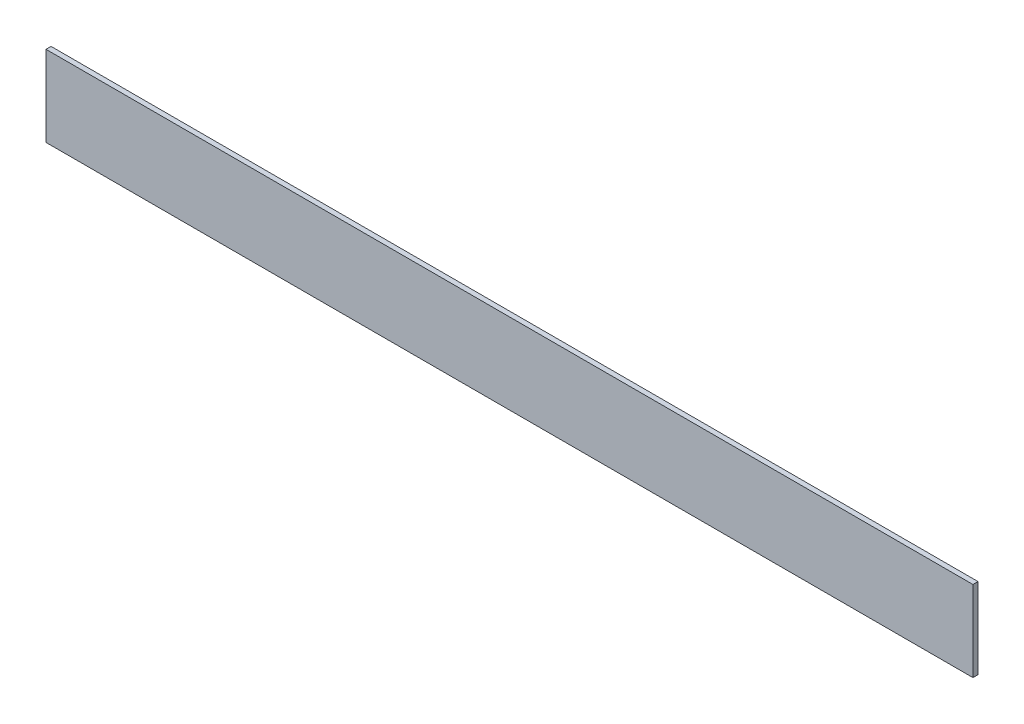
ISO-10303-21;
HEADER;
FILE_DESCRIPTION(('STEP AP214'),'2;1');
FILE_NAME('part.step','',(''),(''),'','','');
FILE_SCHEMA(('AUTOMOTIVE_DESIGN { 1 0 10303 214 1 1 1 1 }'));
ENDSEC;
DATA;
#1=APPLICATION_CONTEXT('core data for automotive mechanical design processes');
#2=APPLICATION_PROTOCOL_DEFINITION('international standard','automotive_design',2000,#1);
#3=PRODUCT_CONTEXT('',#1,'mechanical');
#4=PRODUCT('Part','Part','',(#3));
#5=PRODUCT_RELATED_PRODUCT_CATEGORY('part','',(#4));
#6=PRODUCT_DEFINITION_FORMATION('','',#4);
#7=PRODUCT_DEFINITION_CONTEXT('part definition',#1,'design');
#8=PRODUCT_DEFINITION('design','',#6,#7);
#9=PRODUCT_DEFINITION_SHAPE('','',#8);
#10=(LENGTH_UNIT() NAMED_UNIT(*) SI_UNIT(.MILLI.,.METRE.));
#11=(NAMED_UNIT(*) PLANE_ANGLE_UNIT() SI_UNIT($,.RADIAN.));
#12=(NAMED_UNIT(*) SI_UNIT($,.STERADIAN.) SOLID_ANGLE_UNIT());
#13=UNCERTAINTY_MEASURE_WITH_UNIT(LENGTH_MEASURE(1.E-05),#10,'distance_accuracy_value','');
#14=(GEOMETRIC_REPRESENTATION_CONTEXT(3) GLOBAL_UNCERTAINTY_ASSIGNED_CONTEXT((#13)) GLOBAL_UNIT_ASSIGNED_CONTEXT((#10,
#11,#12)) REPRESENTATION_CONTEXT('',''));
#15=CARTESIAN_POINT('',(0.,0.,0.));
#16=DIRECTION('',(0.,0.,1.));
#17=DIRECTION('',(1.,0.,0.));
#18=AXIS2_PLACEMENT_3D('',#15,#16,#17);
#19=CARTESIAN_POINT('',(-989.093625971225,-1387.5,-16.0000000000001));
#20=DIRECTION('',(1.,0.,0.));
#21=DIRECTION('',(0.,0.,-1.));
#22=AXIS2_PLACEMENT_3D('',#19,#20,#21);
#23=PLANE('',#22);
#24=DIRECTION('',(0.,-1.,0.));
#25=VECTOR('',#24,1.);
#26=CARTESIAN_POINT('',(-989.093625971225,-1387.5,-24.0000000000001));
#27=LINE('',#26,#25);
#28=CARTESIAN_POINT('',(-989.093625971225,-1260.,-24.0000000000001));
#29=VERTEX_POINT('',#28);
#30=CARTESIAN_POINT('',(-989.093625971225,-1387.5,-24.0000000000001));
#31=VERTEX_POINT('',#30);
#32=EDGE_CURVE('E96',#29,#31,#27,.T.);
#33=ORIENTED_EDGE('',*,*,#32,.T.);
#34=DIRECTION('',(0.,0.,-1.));
#35=VECTOR('',#34,1.);
#36=CARTESIAN_POINT('',(-989.093625971225,-1387.5,-16.0000000000001));
#37=LINE('',#36,#35);
#38=CARTESIAN_POINT('',(-989.093625971225,-1387.5,-16.0000000000001));
#39=VERTEX_POINT('',#38);
#40=EDGE_CURVE('E11',#39,#31,#37,.T.);
#41=ORIENTED_EDGE('',*,*,#40,.F.);
#42=DIRECTION('',(0.,-1.,0.));
#43=VECTOR('',#42,1.);
#44=CARTESIAN_POINT('',(-989.093625971225,-1387.5,-16.0000000000001));
#45=LINE('',#44,#43);
#46=CARTESIAN_POINT('',(-989.093625971225,-1260.,-16.0000000000001));
#47=VERTEX_POINT('',#46);
#48=EDGE_CURVE('E84',#47,#39,#45,.T.);
#49=ORIENTED_EDGE('',*,*,#48,.F.);
#50=DIRECTION('',(0.,0.,-1.));
#51=VECTOR('',#50,1.);
#52=CARTESIAN_POINT('',(-989.093625971225,-1260.,-16.0000000000001));
#53=LINE('',#52,#51);
#54=EDGE_CURVE('E92',#47,#29,#53,.T.);
#55=ORIENTED_EDGE('',*,*,#54,.T.);
#56=EDGE_LOOP('',(#33,#41,#49,#55));
#57=FACE_BOUND('',#56,.T.);
#58=ADVANCED_FACE('F33',(#57),#23,.F.);
#59=CARTESIAN_POINT('',(-989.093625971225,-1387.5,-16.0000000000001));
#60=DIRECTION('',(0.,1.,0.));
#61=DIRECTION('',(0.,0.,1.));
#62=AXIS2_PLACEMENT_3D('',#59,#60,#61);
#63=PLANE('',#62);
#64=DIRECTION('',(1.,0.,0.));
#65=VECTOR('',#64,1.);
#66=CARTESIAN_POINT('',(-989.093625971225,-1387.5,-24.0000000000001));
#67=LINE('',#66,#65);
#68=CARTESIAN_POINT('',(475.906374028774,-1387.5,-24.0000000000001));
#69=VERTEX_POINT('',#68);
#70=EDGE_CURVE('E88',#31,#69,#67,.T.);
#71=ORIENTED_EDGE('',*,*,#70,.T.);
#72=DIRECTION('',(0.,0.,-1.));
#73=VECTOR('',#72,1.);
#74=CARTESIAN_POINT('',(475.906374028774,-1387.5,-16.0000000000001));
#75=LINE('',#74,#73);
#76=CARTESIAN_POINT('',(475.906374028774,-1387.5,-16.0000000000001));
#77=VERTEX_POINT('',#76);
#78=EDGE_CURVE('E41',#77,#69,#75,.T.);
#79=ORIENTED_EDGE('',*,*,#78,.F.);
#80=DIRECTION('',(1.,0.,0.));
#81=VECTOR('',#80,1.);
#82=CARTESIAN_POINT('',(-989.093625971225,-1387.5,-16.0000000000001));
#83=LINE('',#82,#81);
#84=EDGE_CURVE('E79',#39,#77,#83,.T.);
#85=ORIENTED_EDGE('',*,*,#84,.F.);
#86=ORIENTED_EDGE('',*,*,#40,.T.);
#87=EDGE_LOOP('',(#71,#79,#85,#86));
#88=FACE_BOUND('',#87,.T.);
#89=ADVANCED_FACE('F87',(#88),#63,.F.);
#90=CARTESIAN_POINT('',(475.906374028774,-1387.5,-16.0000000000001));
#91=DIRECTION('',(-1.,0.,0.));
#92=DIRECTION('',(0.,0.,1.));
#93=AXIS2_PLACEMENT_3D('',#90,#91,#92);
#94=PLANE('',#93);
#95=DIRECTION('',(0.,1.,0.));
#96=VECTOR('',#95,1.);
#97=CARTESIAN_POINT('',(475.906374028774,-1387.5,-24.0000000000001));
#98=LINE('',#97,#96);
#99=CARTESIAN_POINT('',(475.906374028774,-1260.,-24.0000000000001));
#100=VERTEX_POINT('',#99);
#101=EDGE_CURVE('E66',#69,#100,#98,.T.);
#102=ORIENTED_EDGE('',*,*,#101,.T.);
#103=DIRECTION('',(0.,0.,-1.));
#104=VECTOR('',#103,1.);
#105=CARTESIAN_POINT('',(475.906374028774,-1260.,-16.0000000000001));
#106=LINE('',#105,#104);
#107=CARTESIAN_POINT('',(475.906374028774,-1260.,-16.0000000000001));
#108=VERTEX_POINT('',#107);
#109=EDGE_CURVE('E89',#108,#100,#106,.T.);
#110=ORIENTED_EDGE('',*,*,#109,.F.);
#111=DIRECTION('',(0.,1.,0.));
#112=VECTOR('',#111,1.);
#113=CARTESIAN_POINT('',(475.906374028774,-1387.5,-16.0000000000001));
#114=LINE('',#113,#112);
#115=EDGE_CURVE('E82',#77,#108,#114,.T.);
#116=ORIENTED_EDGE('',*,*,#115,.F.);
#117=ORIENTED_EDGE('',*,*,#78,.T.);
#118=EDGE_LOOP('',(#102,#110,#116,#117));
#119=FACE_BOUND('',#118,.T.);
#120=ADVANCED_FACE('F90',(#119),#94,.F.);
#121=CARTESIAN_POINT('',(-989.093625971225,-1260.,-16.0000000000001));
#122=DIRECTION('',(0.,-1.,0.));
#123=DIRECTION('',(0.,0.,-1.));
#124=AXIS2_PLACEMENT_3D('',#121,#122,#123);
#125=PLANE('',#124);
#126=DIRECTION('',(-1.,0.,0.));
#127=VECTOR('',#126,1.);
#128=CARTESIAN_POINT('',(-989.093625971225,-1260.,-24.0000000000001));
#129=LINE('',#128,#127);
#130=EDGE_CURVE('E72',#100,#29,#129,.T.);
#131=ORIENTED_EDGE('',*,*,#130,.T.);
#132=ORIENTED_EDGE('',*,*,#54,.F.);
#133=DIRECTION('',(-1.,0.,0.));
#134=VECTOR('',#133,1.);
#135=CARTESIAN_POINT('',(-989.093625971225,-1260.,-16.0000000000001));
#136=LINE('',#135,#134);
#137=EDGE_CURVE('E49',#108,#47,#136,.T.);
#138=ORIENTED_EDGE('',*,*,#137,.F.);
#139=ORIENTED_EDGE('',*,*,#109,.T.);
#140=EDGE_LOOP('',(#131,#132,#138,#139));
#141=FACE_BOUND('',#140,.T.);
#142=ADVANCED_FACE('F103',(#141),#125,.F.);
#143=CARTESIAN_POINT('',(0.,0.,-16.0000000000001));
#144=DIRECTION('',(0.,0.,-1.));
#145=DIRECTION('',(-1.,0.,0.));
#146=AXIS2_PLACEMENT_3D('',#143,#144,#145);
#147=PLANE('',#146);
#148=ORIENTED_EDGE('',*,*,#48,.T.);
#149=ORIENTED_EDGE('',*,*,#84,.T.);
#150=ORIENTED_EDGE('',*,*,#115,.T.);
#151=ORIENTED_EDGE('',*,*,#137,.T.);
#152=EDGE_LOOP('',(#148,#149,#150,#151));
#153=FACE_BOUND('',#152,.T.);
#154=ADVANCED_FACE('F80',(#153),#147,.F.);
#155=CARTESIAN_POINT('',(0.,0.,-24.0000000000001));
#156=DIRECTION('',(0.,0.,-1.));
#157=DIRECTION('',(-1.,0.,0.));
#158=AXIS2_PLACEMENT_3D('',#155,#156,#157);
#159=PLANE('',#158);
#160=ORIENTED_EDGE('',*,*,#32,.F.);
#161=ORIENTED_EDGE('',*,*,#130,.F.);
#162=ORIENTED_EDGE('',*,*,#101,.F.);
#163=ORIENTED_EDGE('',*,*,#70,.F.);
#164=EDGE_LOOP('',(#160,#161,#162,#163));
#165=FACE_BOUND('',#164,.T.);
#166=ADVANCED_FACE('F106',(#165),#159,.T.);
#167=CLOSED_SHELL('',(#58,#89,#120,#142,#154,#166));
#168=MANIFOLD_SOLID_BREP('B2',#167);
#169=ADVANCED_BREP_SHAPE_REPRESENTATION('',(#18,#168),#14);
#170=SHAPE_DEFINITION_REPRESENTATION(#9,#169);
ENDSEC;
END-ISO-10303-21;
